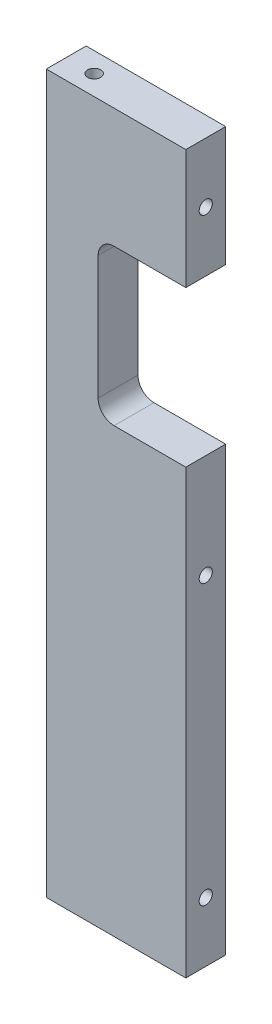
ISO-10303-21;
HEADER;
FILE_DESCRIPTION(('STEP AP214'),'2;1');
FILE_NAME('part.step','',(''),(''),'','','');
FILE_SCHEMA(('AUTOMOTIVE_DESIGN { 1 0 10303 214 1 1 1 1 }'));
ENDSEC;
DATA;
#1=APPLICATION_CONTEXT('core data for automotive mechanical design processes');
#2=APPLICATION_PROTOCOL_DEFINITION('international standard','automotive_design',2000,#1);
#3=PRODUCT_CONTEXT('',#1,'mechanical');
#4=PRODUCT('Part','Part','',(#3));
#5=PRODUCT_RELATED_PRODUCT_CATEGORY('part','',(#4));
#6=PRODUCT_DEFINITION_FORMATION('','',#4);
#7=PRODUCT_DEFINITION_CONTEXT('part definition',#1,'design');
#8=PRODUCT_DEFINITION('design','',#6,#7);
#9=PRODUCT_DEFINITION_SHAPE('','',#8);
#10=(LENGTH_UNIT() NAMED_UNIT(*) SI_UNIT(.MILLI.,.METRE.));
#11=(NAMED_UNIT(*) PLANE_ANGLE_UNIT() SI_UNIT($,.RADIAN.));
#12=(NAMED_UNIT(*) SI_UNIT($,.STERADIAN.) SOLID_ANGLE_UNIT());
#13=UNCERTAINTY_MEASURE_WITH_UNIT(LENGTH_MEASURE(1.E-05),#10,'distance_accuracy_value','');
#14=(GEOMETRIC_REPRESENTATION_CONTEXT(3) GLOBAL_UNCERTAINTY_ASSIGNED_CONTEXT((#13)) GLOBAL_UNIT_ASSIGNED_CONTEXT((#10,
#11,#12)) REPRESENTATION_CONTEXT('',''));
#15=CARTESIAN_POINT('',(0.,0.,0.));
#16=DIRECTION('',(0.,0.,1.));
#17=DIRECTION('',(1.,0.,0.));
#18=AXIS2_PLACEMENT_3D('',#15,#16,#17);
#19=CARTESIAN_POINT('',(6.7953462850714,68.755041031653,10.));
#20=DIRECTION('',(-1.,0.,0.));
#21=DIRECTION('',(0.,-1.,0.));
#22=AXIS2_PLACEMENT_3D('',#19,#20,#21);
#23=PLANE('',#22);
#24=CARTESIAN_POINT('',(6.7953462850714,53.7550410316531,5.00000000000039));
#25=DIRECTION('',(1.,0.,0.));
#26=DIRECTION('',(0.,1.,0.));
#27=AXIS2_PLACEMENT_3D('',#24,#25,#26);
#28=CIRCLE('',#27,1.65000000000039);
#29=CARTESIAN_POINT('',(6.7953462850714,55.4050410316535,5.00000000000039));
#30=VERTEX_POINT('',#29);
#31=EDGE_CURVE('E283',#30,#30,#28,.T.);
#32=ORIENTED_EDGE('',*,*,#31,.F.);
#33=EDGE_LOOP('',(#32));
#34=FACE_BOUND('',#33,.T.);
#35=DIRECTION('',(0.,1.,0.));
#36=VECTOR('',#35,1.);
#37=CARTESIAN_POINT('',(6.7953462850714,68.755041031653,10.));
#38=LINE('',#37,#36);
#39=CARTESIAN_POINT('',(6.79534628507142,38.755041031653,10.));
#40=VERTEX_POINT('',#39);
#41=CARTESIAN_POINT('',(6.7953462850714,68.755041031653,10.));
#42=VERTEX_POINT('',#41);
#43=EDGE_CURVE('E196',#40,#42,#38,.T.);
#44=ORIENTED_EDGE('',*,*,#43,.F.);
#45=DIRECTION('',(0.,0.,-1.));
#46=VECTOR('',#45,1.);
#47=CARTESIAN_POINT('',(6.79534628507142,38.755041031653,39.));
#48=LINE('',#47,#46);
#49=CARTESIAN_POINT('',(6.79534628507142,38.755041031653,0.));
#50=VERTEX_POINT('',#49);
#51=EDGE_CURVE('E183',#40,#50,#48,.T.);
#52=ORIENTED_EDGE('',*,*,#51,.T.);
#53=DIRECTION('',(0.,1.,0.));
#54=VECTOR('',#53,1.);
#55=CARTESIAN_POINT('',(6.7953462850714,68.755041031653,0.));
#56=LINE('',#55,#54);
#57=CARTESIAN_POINT('',(6.7953462850714,68.755041031653,0.));
#58=VERTEX_POINT('',#57);
#59=EDGE_CURVE('E206',#50,#58,#56,.T.);
#60=ORIENTED_EDGE('',*,*,#59,.T.);
#61=DIRECTION('',(0.,0.,-1.));
#62=VECTOR('',#61,1.);
#63=CARTESIAN_POINT('',(6.7953462850714,68.755041031653,10.));
#64=LINE('',#63,#62);
#65=EDGE_CURVE('E212',#42,#58,#64,.T.);
#66=ORIENTED_EDGE('',*,*,#65,.F.);
#67=EDGE_LOOP('',(#44,#52,#60,#66));
#68=FACE_BOUND('',#67,.T.);
#69=ADVANCED_FACE('F33',(#34,#68),#23,.F.);
#70=CARTESIAN_POINT('',(-28.2046537149286,68.755041031653,10.));
#71=DIRECTION('',(1.,0.,0.));
#72=DIRECTION('',(0.,1.,0.));
#73=AXIS2_PLACEMENT_3D('',#70,#71,#72);
#74=PLANE('',#73);
#75=CARTESIAN_POINT('',(-28.2046537149286,-81.3481814049515,4.99999999999995));
#76=DIRECTION('',(-1.,0.,0.));
#77=DIRECTION('',(0.,-1.,0.));
#78=AXIS2_PLACEMENT_3D('',#75,#76,#77);
#79=CIRCLE('',#78,1.65);
#80=CARTESIAN_POINT('',(-28.2046537149286,-82.9981814049516,4.99999999999995));
#81=VERTEX_POINT('',#80);
#82=EDGE_CURVE('E292',#81,#81,#79,.T.);
#83=ORIENTED_EDGE('',*,*,#82,.F.);
#84=EDGE_LOOP('',(#83));
#85=FACE_BOUND('',#84,.T.);
#86=CARTESIAN_POINT('',(-28.2046537149286,-21.3481814049516,4.99999999999994));
#87=DIRECTION('',(-1.,0.,0.));
#88=DIRECTION('',(0.,-1.,0.));
#89=AXIS2_PLACEMENT_3D('',#86,#87,#88);
#90=CIRCLE('',#89,1.65);
#91=CARTESIAN_POINT('',(-28.2046537149286,-22.9981814049516,4.99999999999994));
#92=VERTEX_POINT('',#91);
#93=EDGE_CURVE('E298',#92,#92,#90,.T.);
#94=ORIENTED_EDGE('',*,*,#93,.F.);
#95=EDGE_LOOP('',(#94));
#96=FACE_BOUND('',#95,.T.);
#97=CARTESIAN_POINT('',(-28.2046537149286,38.6518185950484,4.99999999999993));
#98=DIRECTION('',(-1.,0.,0.));
#99=DIRECTION('',(0.,-1.,0.));
#100=AXIS2_PLACEMENT_3D('',#97,#98,#99);
#101=CIRCLE('',#100,1.65);
#102=CARTESIAN_POINT('',(-28.2046537149286,37.0018185950484,4.99999999999993));
#103=VERTEX_POINT('',#102);
#104=EDGE_CURVE('E125',#103,#103,#101,.T.);
#105=ORIENTED_EDGE('',*,*,#104,.F.);
#106=EDGE_LOOP('',(#105));
#107=FACE_BOUND('',#106,.T.);
#108=DIRECTION('',(0.,-1.,0.));
#109=VECTOR('',#108,1.);
#110=CARTESIAN_POINT('',(-28.2046537149286,68.755041031653,0.));
#111=LINE('',#110,#109);
#112=CARTESIAN_POINT('',(-28.2046537149286,68.755041031653,0.));
#113=VERTEX_POINT('',#112);
#114=CARTESIAN_POINT('',(-28.2046537149286,-111.244958968347,0.));
#115=VERTEX_POINT('',#114);
#116=EDGE_CURVE('E189',#113,#115,#111,.T.);
#117=ORIENTED_EDGE('',*,*,#116,.T.);
#118=DIRECTION('',(0.,0.,-1.));
#119=VECTOR('',#118,1.);
#120=CARTESIAN_POINT('',(-28.2046537149286,-111.244958968347,10.));
#121=LINE('',#120,#119);
#122=CARTESIAN_POINT('',(-28.2046537149286,-111.244958968347,10.));
#123=VERTEX_POINT('',#122);
#124=EDGE_CURVE('E168',#123,#115,#121,.T.);
#125=ORIENTED_EDGE('',*,*,#124,.F.);
#126=DIRECTION('',(0.,-1.,0.));
#127=VECTOR('',#126,1.);
#128=CARTESIAN_POINT('',(-28.2046537149286,68.755041031653,10.));
#129=LINE('',#128,#127);
#130=CARTESIAN_POINT('',(-28.2046537149286,68.755041031653,10.));
#131=VERTEX_POINT('',#130);
#132=EDGE_CURVE('E190',#131,#123,#129,.T.);
#133=ORIENTED_EDGE('',*,*,#132,.F.);
#134=DIRECTION('',(0.,0.,-1.));
#135=VECTOR('',#134,1.);
#136=CARTESIAN_POINT('',(-28.2046537149286,68.755041031653,10.));
#137=LINE('',#136,#135);
#138=EDGE_CURVE('E201',#131,#113,#137,.T.);
#139=ORIENTED_EDGE('',*,*,#138,.T.);
#140=EDGE_LOOP('',(#117,#125,#133,#139));
#141=FACE_BOUND('',#140,.T.);
#142=ADVANCED_FACE('F225',(#85,#96,#107,#141),#74,.F.);
#143=CARTESIAN_POINT('',(-28.2046537149286,-111.244958968347,10.));
#144=DIRECTION('',(0.,1.,0.));
#145=DIRECTION('',(0.,0.,1.));
#146=AXIS2_PLACEMENT_3D('',#143,#144,#145);
#147=PLANE('',#146);
#148=CARTESIAN_POINT('',(-3.20465371492858,-111.244958968347,5.));
#149=DIRECTION('',(0.,-1.,0.));
#150=DIRECTION('',(0.,0.,-1.));
#151=AXIS2_PLACEMENT_3D('',#148,#149,#150);
#152=CIRCLE('',#151,1.20791329456803);
#153=CARTESIAN_POINT('',(-3.20465371492858,-111.244958968347,3.79208670543197));
#154=VERTEX_POINT('',#153);
#155=EDGE_CURVE('E388',#154,#154,#152,.T.);
#156=ORIENTED_EDGE('',*,*,#155,.F.);
#157=EDGE_LOOP('',(#156));
#158=FACE_BOUND('',#157,.T.);
#159=CARTESIAN_POINT('',(-22.2046537149286,-111.244958968347,5.));
#160=DIRECTION('',(0.,-1.,0.));
#161=DIRECTION('',(0.,0.,-1.));
#162=AXIS2_PLACEMENT_3D('',#159,#160,#161);
#163=CIRCLE('',#162,1.13947294137543);
#164=CARTESIAN_POINT('',(-22.2046537149286,-111.244958968347,3.86052705862457));
#165=VERTEX_POINT('',#164);
#166=EDGE_CURVE('E398',#165,#165,#163,.T.);
#167=ORIENTED_EDGE('',*,*,#166,.F.);
#168=EDGE_LOOP('',(#167));
#169=FACE_BOUND('',#168,.T.);
#170=DIRECTION('',(1.,0.,0.));
#171=VECTOR('',#170,1.);
#172=CARTESIAN_POINT('',(-28.2046537149286,-111.244958968347,0.));
#173=LINE('',#172,#171);
#174=CARTESIAN_POINT('',(6.79534628507142,-111.244958968347,0.));
#175=VERTEX_POINT('',#174);
#176=EDGE_CURVE('E204',#115,#175,#173,.T.);
#177=ORIENTED_EDGE('',*,*,#176,.T.);
#178=DIRECTION('',(0.,0.,-1.));
#179=VECTOR('',#178,1.);
#180=CARTESIAN_POINT('',(6.79534628507142,-111.244958968347,10.));
#181=LINE('',#180,#179);
#182=CARTESIAN_POINT('',(6.79534628507142,-111.244958968347,10.));
#183=VERTEX_POINT('',#182);
#184=EDGE_CURVE('E215',#183,#175,#181,.T.);
#185=ORIENTED_EDGE('',*,*,#184,.F.);
#186=DIRECTION('',(1.,0.,0.));
#187=VECTOR('',#186,1.);
#188=CARTESIAN_POINT('',(-28.2046537149286,-111.244958968347,10.));
#189=LINE('',#188,#187);
#190=EDGE_CURVE('E193',#123,#183,#189,.T.);
#191=ORIENTED_EDGE('',*,*,#190,.F.);
#192=ORIENTED_EDGE('',*,*,#124,.T.);
#193=EDGE_LOOP('',(#177,#185,#191,#192));
#194=FACE_BOUND('',#193,.T.);
#195=ADVANCED_FACE('F220',(#158,#169,#194),#147,.F.);
#196=CARTESIAN_POINT('',(6.79534628507142,-96.244958968347,4.99999999999977));
#197=DIRECTION('',(1.,0.,0.));
#198=DIRECTION('',(0.,1.,0.));
#199=AXIS2_PLACEMENT_3D('',#196,#197,#198);
#200=CIRCLE('',#199,1.64999999999984);
#201=CARTESIAN_POINT('',(6.79534628507142,-94.5949589683471,4.99999999999977));
#202=VERTEX_POINT('',#201);
#203=EDGE_CURVE('E274',#202,#202,#200,.T.);
#204=ORIENTED_EDGE('',*,*,#203,.F.);
#205=EDGE_LOOP('',(#204));
#206=FACE_BOUND('',#205,.T.);
#207=CARTESIAN_POINT('',(6.79534628507141,-26.2449589683469,5.00000000000008));
#208=DIRECTION('',(1.,0.,0.));
#209=DIRECTION('',(0.,1.,0.));
#210=AXIS2_PLACEMENT_3D('',#207,#208,#209);
#211=CIRCLE('',#210,1.65000000000012);
#212=CARTESIAN_POINT('',(6.79534628507141,-24.5949589683468,5.00000000000008));
#213=VERTEX_POINT('',#212);
#214=EDGE_CURVE('E277',#213,#213,#211,.T.);
#215=ORIENTED_EDGE('',*,*,#214,.F.);
#216=EDGE_LOOP('',(#215));
#217=FACE_BOUND('',#216,.T.);
#218=CARTESIAN_POINT('',(6.79534628507141,-0.244958968347003,0.));
#219=VERTEX_POINT('',#218);
#220=EDGE_CURVE('E207',#175,#219,#56,.T.);
#221=ORIENTED_EDGE('',*,*,#220,.T.);
#222=DIRECTION('',(0.,0.,-1.));
#223=VECTOR('',#222,1.);
#224=CARTESIAN_POINT('',(6.79534628507142,-0.244958968347024,39.));
#225=LINE('',#224,#223);
#226=CARTESIAN_POINT('',(6.79534628507142,-0.244958968347024,10.));
#227=VERTEX_POINT('',#226);
#228=EDGE_CURVE('E173',#227,#219,#225,.T.);
#229=ORIENTED_EDGE('',*,*,#228,.F.);
#230=EDGE_CURVE('E197',#183,#227,#38,.T.);
#231=ORIENTED_EDGE('',*,*,#230,.F.);
#232=ORIENTED_EDGE('',*,*,#184,.T.);
#233=EDGE_LOOP('',(#221,#229,#231,#232));
#234=FACE_BOUND('',#233,.T.);
#235=ADVANCED_FACE('F231',(#206,#217,#234),#23,.F.);
#236=CARTESIAN_POINT('',(-28.2046537149286,68.755041031653,10.));
#237=DIRECTION('',(0.,-1.,0.));
#238=DIRECTION('',(0.,0.,-1.));
#239=AXIS2_PLACEMENT_3D('',#236,#237,#238);
#240=PLANE('',#239);
#241=CARTESIAN_POINT('',(-21.2046537149285,68.755041031653,4.99999999999998));
#242=DIRECTION('',(0.,1.,0.));
#243=DIRECTION('',(0.,0.,1.));
#244=AXIS2_PLACEMENT_3D('',#241,#242,#243);
#245=CIRCLE('',#244,1.6499999999984);
#246=CARTESIAN_POINT('',(-21.2046537149285,68.755041031653,6.64999999999837));
#247=VERTEX_POINT('',#246);
#248=EDGE_CURVE('E389',#247,#247,#245,.T.);
#249=ORIENTED_EDGE('',*,*,#248,.F.);
#250=EDGE_LOOP('',(#249));
#251=FACE_BOUND('',#250,.T.);
#252=DIRECTION('',(-1.,0.,0.));
#253=VECTOR('',#252,1.);
#254=CARTESIAN_POINT('',(-28.2046537149286,68.755041031653,0.));
#255=LINE('',#254,#253);
#256=EDGE_CURVE('E194',#58,#113,#255,.T.);
#257=ORIENTED_EDGE('',*,*,#256,.T.);
#258=ORIENTED_EDGE('',*,*,#138,.F.);
#259=DIRECTION('',(-1.,0.,0.));
#260=VECTOR('',#259,1.);
#261=CARTESIAN_POINT('',(-28.2046537149286,68.755041031653,10.));
#262=LINE('',#261,#260);
#263=EDGE_CURVE('E199',#42,#131,#262,.T.);
#264=ORIENTED_EDGE('',*,*,#263,.F.);
#265=ORIENTED_EDGE('',*,*,#65,.T.);
#266=EDGE_LOOP('',(#257,#258,#264,#265));
#267=FACE_BOUND('',#266,.T.);
#268=ADVANCED_FACE('F237',(#251,#267),#240,.F.);
#269=CARTESIAN_POINT('',(0.,0.,10.));
#270=DIRECTION('',(0.,0.,1.));
#271=DIRECTION('',(1.,0.,0.));
#272=AXIS2_PLACEMENT_3D('',#269,#270,#271);
#273=PLANE('',#272);
#274=DIRECTION('',(-1.,0.,0.));
#275=VECTOR('',#274,1.);
#276=CARTESIAN_POINT('',(0.,38.755041031653,10.));
#277=LINE('',#276,#275);
#278=CARTESIAN_POINT('',(-11.2046537149286,38.755041031653,10.));
#279=VERTEX_POINT('',#278);
#280=EDGE_CURVE('E164',#40,#279,#277,.T.);
#281=ORIENTED_EDGE('',*,*,#280,.F.);
#282=ORIENTED_EDGE('',*,*,#43,.T.);
#283=ORIENTED_EDGE('',*,*,#263,.T.);
#284=ORIENTED_EDGE('',*,*,#132,.T.);
#285=ORIENTED_EDGE('',*,*,#190,.T.);
#286=ORIENTED_EDGE('',*,*,#230,.T.);
#287=DIRECTION('',(1.,0.,0.));
#288=VECTOR('',#287,1.);
#289=CARTESIAN_POINT('',(0.,-0.244958968347024,10.));
#290=LINE('',#289,#288);
#291=CARTESIAN_POINT('',(-11.2046537149286,-0.244958968347024,10.));
#292=VERTEX_POINT('',#291);
#293=EDGE_CURVE('E155',#292,#227,#290,.T.);
#294=ORIENTED_EDGE('',*,*,#293,.F.);
#295=CARTESIAN_POINT('',(-11.2046537149286,3.75504103165297,10.));
#296=DIRECTION('',(0.,0.,1.));
#297=DIRECTION('',(1.,0.,0.));
#298=AXIS2_PLACEMENT_3D('',#295,#296,#297);
#299=CIRCLE('',#298,4.);
#300=CARTESIAN_POINT('',(-15.2046537149286,3.75504103165297,10.));
#301=VERTEX_POINT('',#300);
#302=EDGE_CURVE('E121',#292,#301,#299,.F.);
#303=ORIENTED_EDGE('',*,*,#302,.T.);
#304=DIRECTION('',(0.,-1.,0.));
#305=VECTOR('',#304,1.);
#306=CARTESIAN_POINT('',(-15.2046537149286,0.,10.));
#307=LINE('',#306,#305);
#308=CARTESIAN_POINT('',(-15.2046537149286,34.755041031653,10.));
#309=VERTEX_POINT('',#308);
#310=EDGE_CURVE('E153',#309,#301,#307,.T.);
#311=ORIENTED_EDGE('',*,*,#310,.F.);
#312=CARTESIAN_POINT('',(-11.2046537149286,34.755041031653,10.));
#313=DIRECTION('',(0.,0.,1.));
#314=DIRECTION('',(1.,0.,0.));
#315=AXIS2_PLACEMENT_3D('',#312,#313,#314);
#316=CIRCLE('',#315,4.);
#317=EDGE_CURVE('E134',#309,#279,#316,.F.);
#318=ORIENTED_EDGE('',*,*,#317,.T.);
#319=EDGE_LOOP('',(#281,#282,#283,#284,#285,#286,#294,#303,#311,#318));
#320=FACE_BOUND('',#319,.T.);
#321=ADVANCED_FACE('F152',(#320),#273,.T.);
#322=CARTESIAN_POINT('',(0.,0.,0.));
#323=DIRECTION('',(0.,0.,1.));
#324=DIRECTION('',(1.,0.,0.));
#325=AXIS2_PLACEMENT_3D('',#322,#323,#324);
#326=PLANE('',#325);
#327=ORIENTED_EDGE('',*,*,#59,.F.);
#328=DIRECTION('',(1.,0.,0.));
#329=VECTOR('',#328,1.);
#330=CARTESIAN_POINT('',(6.79534628507142,38.755041031653,0.));
#331=LINE('',#330,#329);
#332=CARTESIAN_POINT('',(-11.2046537149286,38.755041031653,0.));
#333=VERTEX_POINT('',#332);
#334=EDGE_CURVE('E178',#333,#50,#331,.T.);
#335=ORIENTED_EDGE('',*,*,#334,.F.);
#336=CARTESIAN_POINT('',(-11.2046537149286,34.755041031653,0.));
#337=DIRECTION('',(0.,0.,1.));
#338=DIRECTION('',(1.,0.,0.));
#339=AXIS2_PLACEMENT_3D('',#336,#337,#338);
#340=CIRCLE('',#339,4.);
#341=CARTESIAN_POINT('',(-15.2046537149286,34.755041031653,0.));
#342=VERTEX_POINT('',#341);
#343=EDGE_CURVE('E142',#333,#342,#340,.T.);
#344=ORIENTED_EDGE('',*,*,#343,.T.);
#345=DIRECTION('',(0.,1.,0.));
#346=VECTOR('',#345,1.);
#347=CARTESIAN_POINT('',(-15.2046537149286,38.755041031653,0.));
#348=LINE('',#347,#346);
#349=CARTESIAN_POINT('',(-15.2046537149286,3.75504103165297,0.));
#350=VERTEX_POINT('',#349);
#351=EDGE_CURVE('E176',#350,#342,#348,.T.);
#352=ORIENTED_EDGE('',*,*,#351,.F.);
#353=CARTESIAN_POINT('',(-11.2046537149286,3.75504103165297,0.));
#354=DIRECTION('',(0.,0.,1.));
#355=DIRECTION('',(1.,0.,0.));
#356=AXIS2_PLACEMENT_3D('',#353,#354,#355);
#357=CIRCLE('',#356,4.);
#358=CARTESIAN_POINT('',(-11.2046537149286,-0.244958968347024,0.));
#359=VERTEX_POINT('',#358);
#360=EDGE_CURVE('E59',#350,#359,#357,.T.);
#361=ORIENTED_EDGE('',*,*,#360,.T.);
#362=DIRECTION('',(-1.,0.,0.));
#363=VECTOR('',#362,1.);
#364=CARTESIAN_POINT('',(6.79534628507142,-0.244958968347024,0.));
#365=LINE('',#364,#363);
#366=EDGE_CURVE('E124',#219,#359,#365,.T.);
#367=ORIENTED_EDGE('',*,*,#366,.F.);
#368=ORIENTED_EDGE('',*,*,#220,.F.);
#369=ORIENTED_EDGE('',*,*,#176,.F.);
#370=ORIENTED_EDGE('',*,*,#116,.F.);
#371=ORIENTED_EDGE('',*,*,#256,.F.);
#372=EDGE_LOOP('',(#327,#335,#344,#352,#361,#367,#368,#369,#370,#371));
#373=FACE_BOUND('',#372,.T.);
#374=ADVANCED_FACE('F229',(#373),#326,.F.);
#375=CARTESIAN_POINT('',(6.79534628507142,38.755041031653,39.));
#376=DIRECTION('',(0.,1.,0.));
#377=DIRECTION('',(0.,0.,1.));
#378=AXIS2_PLACEMENT_3D('',#375,#376,#377);
#379=PLANE('',#378);
#380=ORIENTED_EDGE('',*,*,#280,.T.);
#381=DIRECTION('',(0.,0.,-1.));
#382=VECTOR('',#381,1.);
#383=CARTESIAN_POINT('',(-11.2046537149286,38.755041031653,0.));
#384=LINE('',#383,#382);
#385=EDGE_CURVE('E137',#279,#333,#384,.T.);
#386=ORIENTED_EDGE('',*,*,#385,.T.);
#387=ORIENTED_EDGE('',*,*,#334,.T.);
#388=ORIENTED_EDGE('',*,*,#51,.F.);
#389=EDGE_LOOP('',(#380,#386,#387,#388));
#390=FACE_BOUND('',#389,.T.);
#391=ADVANCED_FACE('F241',(#390),#379,.F.);
#392=CARTESIAN_POINT('',(-15.2046537149286,38.755041031653,39.));
#393=DIRECTION('',(-1.,0.,0.));
#394=DIRECTION('',(0.,-1.,0.));
#395=AXIS2_PLACEMENT_3D('',#392,#393,#394);
#396=PLANE('',#395);
#397=ORIENTED_EDGE('',*,*,#351,.T.);
#398=DIRECTION('',(0.,0.,-1.));
#399=VECTOR('',#398,1.);
#400=CARTESIAN_POINT('',(-15.2046537149286,34.755041031653,10.));
#401=LINE('',#400,#399);
#402=EDGE_CURVE('E135',#342,#309,#401,.F.);
#403=ORIENTED_EDGE('',*,*,#402,.T.);
#404=ORIENTED_EDGE('',*,*,#310,.T.);
#405=DIRECTION('',(0.,0.,-1.));
#406=VECTOR('',#405,1.);
#407=CARTESIAN_POINT('',(-15.2046537149286,3.75504103165297,0.));
#408=LINE('',#407,#406);
#409=EDGE_CURVE('E163',#301,#350,#408,.T.);
#410=ORIENTED_EDGE('',*,*,#409,.T.);
#411=EDGE_LOOP('',(#397,#403,#404,#410));
#412=FACE_BOUND('',#411,.T.);
#413=ADVANCED_FACE('F162',(#412),#396,.F.);
#414=CARTESIAN_POINT('',(6.79534628507142,-0.244958968347024,39.));
#415=DIRECTION('',(0.,-1.,0.));
#416=DIRECTION('',(0.,0.,-1.));
#417=AXIS2_PLACEMENT_3D('',#414,#415,#416);
#418=PLANE('',#417);
#419=ORIENTED_EDGE('',*,*,#366,.T.);
#420=DIRECTION('',(0.,0.,-1.));
#421=VECTOR('',#420,1.);
#422=CARTESIAN_POINT('',(-11.2046537149286,-0.244958968347024,10.));
#423=LINE('',#422,#421);
#424=EDGE_CURVE('E145',#359,#292,#423,.F.);
#425=ORIENTED_EDGE('',*,*,#424,.T.);
#426=ORIENTED_EDGE('',*,*,#293,.T.);
#427=ORIENTED_EDGE('',*,*,#228,.T.);
#428=EDGE_LOOP('',(#419,#425,#426,#427));
#429=FACE_BOUND('',#428,.T.);
#430=ADVANCED_FACE('F130',(#429),#418,.F.);
#431=CARTESIAN_POINT('',(-11.2046537149286,34.755041031653,39.));
#432=DIRECTION('',(0.,0.,1.));
#433=DIRECTION('',(1.,0.,0.));
#434=AXIS2_PLACEMENT_3D('',#431,#432,#433);
#435=CYLINDRICAL_SURFACE('',#434,4.);
#436=DIRECTION('',(0.,0.,1.));
#437=VECTOR('',#436,1.);
#438=CARTESIAN_POINT('',(-13.2046537149286,38.2191426467907,39.));
#439=LINE('',#438,#437);
#440=CARTESIAN_POINT('',(-13.2046537149286,38.2191426467907,3.40774012052067));
#441=VERTEX_POINT('',#440);
#442=CARTESIAN_POINT('',(-13.2046537149286,38.2191426467907,6.59225987947918));
#443=VERTEX_POINT('',#442);
#444=EDGE_CURVE('E45',#441,#443,#439,.T.);
#445=ORIENTED_EDGE('',*,*,#444,.F.);
#446=CARTESIAN_POINT('',(-13.2046537149286,38.2191426467907,3.40774012052067));
#447=CARTESIAN_POINT('',(-13.2642924296829,38.1847276792713,3.41710538323452));
#448=CARTESIAN_POINT('',(-13.3228757293052,38.1488344405188,3.42804561424965));
#449=CARTESIAN_POINT('',(-13.4376700752825,38.0744230621559,3.45381715263762));
#450=CARTESIAN_POINT('',(-13.4938748336372,38.0358985926818,3.46865810668761));
#451=CARTESIAN_POINT('',(-13.6038471794177,37.9563720774322,3.50308861550594));
#452=CARTESIAN_POINT('',(-13.6575879176569,37.915350667395,3.52272017506465));
#453=CARTESIAN_POINT('',(-13.7615098597266,37.8318782333102,3.56736689783489));
#454=CARTESIAN_POINT('',(-13.8116949831458,37.7894288620303,3.59237600627532));
#455=CARTESIAN_POINT('',(-13.925604727016,37.6883187301122,3.65872044783551));
#456=CARTESIAN_POINT('',(-13.9876049217287,37.6293836157799,3.70268463530359));
#457=CARTESIAN_POINT('',(-14.1024137552706,37.5135946609107,3.80301120936347));
#458=CARTESIAN_POINT('',(-14.1552558611104,37.4567338686988,3.85932667323366));
#459=CARTESIAN_POINT('',(-14.2512178605752,37.3480622648806,3.98526297537314));
#460=CARTESIAN_POINT('',(-14.2942404687509,37.2963046486165,4.05500530950665));
#461=CARTESIAN_POINT('',(-14.369037412493,37.2025501705478,4.20626071376057));
#462=CARTESIAN_POINT('',(-14.4008085082809,37.1605561212737,4.28777716464205));
#463=CARTESIAN_POINT('',(-14.4494043912106,37.0944985889438,4.44878227672643));
#464=CARTESIAN_POINT('',(-14.4676213525072,37.0688284620704,4.52719607847443));
#465=CARTESIAN_POINT('',(-14.4952405245041,37.0293822073102,4.68843103006114));
#466=CARTESIAN_POINT('',(-14.5046476344806,37.0155994690248,4.77124970317725));
#467=CARTESIAN_POINT('',(-14.5143465138706,37.0013709408,4.93234090881226));
#468=CARTESIAN_POINT('',(-14.5152598326611,37.0000158448736,5.01049780752084));
#469=CARTESIAN_POINT('',(-14.5095990749262,37.0083412945583,5.16593741985314));
#470=CARTESIAN_POINT('',(-14.5030265765769,37.0180195141027,5.24322031426786));
#471=CARTESIAN_POINT('',(-14.4824894769143,37.047661340446,5.39367823142939));
#472=CARTESIAN_POINT('',(-14.4686237247097,37.0674873152433,5.46689404731204));
#473=CARTESIAN_POINT('',(-14.4335311731108,37.116236986968,5.6083471219315));
#474=CARTESIAN_POINT('',(-14.4123043870978,37.1451606673573,5.67658438971827));
#475=CARTESIAN_POINT('',(-14.3619927217173,37.2112506120984,5.80795669096328));
#476=CARTESIAN_POINT('',(-14.3327395025234,37.2485899825227,5.87093967078864));
#477=CARTESIAN_POINT('',(-14.2668960266488,37.3290198848195,5.98883855281108));
#478=CARTESIAN_POINT('',(-14.2303050734851,37.3721109625026,6.04375368836658));
#479=CARTESIAN_POINT('',(-14.1471825252445,37.4653387587183,6.14894956168483));
#480=CARTESIAN_POINT('',(-14.1000982754326,37.5157628637655,6.19853501199842));
#481=CARTESIAN_POINT('',(-13.9988540387906,37.6181916279643,6.28792371661644));
#482=CARTESIAN_POINT('',(-13.9446873246863,37.6701977532949,6.32771756547938));
#483=CARTESIAN_POINT('',(-13.8440164003838,37.7612377292662,6.38983332716543));
#484=CARTESIAN_POINT('',(-13.7987747642181,37.8004014058368,6.41405798053416));
#485=CARTESIAN_POINT('',(-13.7052011808638,37.877691091772,6.45780630143834));
#486=CARTESIAN_POINT('',(-13.6568676845566,37.9158165671095,6.47732758872175));
#487=CARTESIAN_POINT('',(-13.5575379990699,37.9904386310882,6.51220808905478));
#488=CARTESIAN_POINT('',(-13.5065418536423,38.026935246476,6.52756737046759));
#489=CARTESIAN_POINT('',(-13.4022267904025,38.0978916177419,6.55470552741307));
#490=CARTESIAN_POINT('',(-13.3489074022261,38.132350957793,6.5664836740212));
#491=CARTESIAN_POINT('',(-13.2649011496663,38.1838308445226,6.58235505172505));
#492=CARTESIAN_POINT('',(-13.2349133239285,38.2016744542636,6.58751140938134));
#493=CARTESIAN_POINT('',(-13.2046537149286,38.2191426467907,6.59225987947918));
#494=B_SPLINE_CURVE_WITH_KNOTS('',3,(#446,#447,#448,#449,#450,#451,#452,#453,#454,#455,#456,
#457,#458,#459,#460,#461,#462,#463,#464,#465,#466,#467,#468,#469,#470,#471,#472,#473,#474,#475,
#476,#477,#478,#479,#480,#481,#482,#483,#484,#485,#486,#487,#488,#489,#490,#491,#492,#493),
.UNSPECIFIED.,.F.,.F.,(4,2,2,2,2,2,2,2,2,2,2,2,2,2,2,2,2,2,2,2,2,2,2,4),(0.,0.208486995833814,
0.417494522391955,0.628405020995758,0.83907928005501,1.1264707914321,1.41278884724323,
1.70183107331425,1.99095645912517,2.24309143273943,2.49508610730796,2.72848121031579,
2.96182711757364,3.19208890616487,3.42235027617772,3.65786861839287,3.89340932612807,
4.14731686897784,4.40146736194077,4.59487790049401,4.78838611449274,4.9818911498221,
5.1754355459395,5.28122935784022),.UNSPECIFIED.);
#495=EDGE_CURVE('E11',#441,#443,#494,.T.);
#496=ORIENTED_EDGE('',*,*,#495,.T.);
#497=EDGE_LOOP('',(#445,#496));
#498=FACE_BOUND('',#497,.T.);
#499=ORIENTED_EDGE('',*,*,#317,.F.);
#500=ORIENTED_EDGE('',*,*,#402,.F.);
#501=ORIENTED_EDGE('',*,*,#343,.F.);
#502=ORIENTED_EDGE('',*,*,#385,.F.);
#503=EDGE_LOOP('',(#499,#500,#501,#502));
#504=FACE_BOUND('',#503,.T.);
#505=ADVANCED_FACE('F127',(#498,#504),#435,.F.);
#506=CARTESIAN_POINT('',(-11.2046537149286,3.75504103165297,39.));
#507=DIRECTION('',(0.,0.,1.));
#508=DIRECTION('',(1.,0.,0.));
#509=AXIS2_PLACEMENT_3D('',#506,#507,#508);
#510=CYLINDRICAL_SURFACE('',#509,4.);
#511=ORIENTED_EDGE('',*,*,#302,.F.);
#512=ORIENTED_EDGE('',*,*,#424,.F.);
#513=ORIENTED_EDGE('',*,*,#360,.F.);
#514=ORIENTED_EDGE('',*,*,#409,.F.);
#515=EDGE_LOOP('',(#511,#512,#513,#514));
#516=FACE_BOUND('',#515,.T.);
#517=ADVANCED_FACE('F35',(#516),#510,.F.);
#518=CARTESIAN_POINT('',(-13.2046537149286,38.6518185950484,4.99999999999993));
#519=DIRECTION('',(-1.,0.,0.));
#520=DIRECTION('',(0.,-1.,0.));
#521=AXIS2_PLACEMENT_3D('',#518,#519,#520);
#522=CYLINDRICAL_SURFACE('',#521,1.65);
#523=ORIENTED_EDGE('',*,*,#104,.T.);
#524=EDGE_LOOP('',(#523));
#525=FACE_BOUND('',#524,.T.);
#526=CARTESIAN_POINT('',(-13.2046537149286,38.6518185950484,4.99999999999993));
#527=DIRECTION('',(-1.,0.,0.));
#528=DIRECTION('',(0.,-1.,0.));
#529=AXIS2_PLACEMENT_3D('',#526,#527,#528);
#530=CIRCLE('',#529,1.65);
#531=EDGE_CURVE('E51',#443,#441,#530,.T.);
#532=ORIENTED_EDGE('',*,*,#531,.F.);
#533=ORIENTED_EDGE('',*,*,#495,.F.);
#534=EDGE_LOOP('',(#532,#533));
#535=FACE_BOUND('',#534,.T.);
#536=ADVANCED_FACE('F123',(#525,#535),#522,.F.);
#537=CARTESIAN_POINT('',(-13.2046537149286,38.6518185950484,4.99999999999993));
#538=DIRECTION('',(-1.,0.,0.));
#539=DIRECTION('',(0.,-1.,0.));
#540=AXIS2_PLACEMENT_3D('',#537,#538,#539);
#541=PLANE('',#540);
#542=ORIENTED_EDGE('',*,*,#444,.T.);
#543=ORIENTED_EDGE('',*,*,#531,.T.);
#544=EDGE_LOOP('',(#542,#543));
#545=FACE_BOUND('',#544,.T.);
#546=ADVANCED_FACE('F119',(#545),#541,.T.);
#547=CARTESIAN_POINT('',(-13.2046537149286,-21.3481814049516,4.99999999999994));
#548=DIRECTION('',(-1.,0.,0.));
#549=DIRECTION('',(0.,-1.,0.));
#550=AXIS2_PLACEMENT_3D('',#547,#548,#549);
#551=CYLINDRICAL_SURFACE('',#550,1.65);
#552=CARTESIAN_POINT('',(-13.2046537149286,-21.3481814049516,4.99999999999994));
#553=DIRECTION('',(-1.,0.,0.));
#554=DIRECTION('',(0.,-1.,0.));
#555=AXIS2_PLACEMENT_3D('',#552,#553,#554);
#556=CIRCLE('',#555,1.65);
#557=CARTESIAN_POINT('',(-13.2046537149286,-22.9981814049516,4.99999999999994));
#558=VERTEX_POINT('',#557);
#559=EDGE_CURVE('E301',#558,#558,#556,.T.);
#560=ORIENTED_EDGE('',*,*,#559,.F.);
#561=EDGE_LOOP('',(#560));
#562=FACE_BOUND('',#561,.T.);
#563=ORIENTED_EDGE('',*,*,#93,.T.);
#564=EDGE_LOOP('',(#563));
#565=FACE_BOUND('',#564,.T.);
#566=ADVANCED_FACE('F307',(#562,#565),#551,.F.);
#567=CARTESIAN_POINT('',(-13.2046537149286,-21.3481814049516,4.99999999999994));
#568=DIRECTION('',(-1.,0.,0.));
#569=DIRECTION('',(0.,-1.,0.));
#570=AXIS2_PLACEMENT_3D('',#567,#568,#569);
#571=PLANE('',#570);
#572=ORIENTED_EDGE('',*,*,#559,.T.);
#573=EDGE_LOOP('',(#572));
#574=FACE_BOUND('',#573,.T.);
#575=ADVANCED_FACE('F323',(#574),#571,.T.);
#576=CARTESIAN_POINT('',(-13.2046537149286,-81.3481814049515,4.99999999999995));
#577=DIRECTION('',(-1.,0.,0.));
#578=DIRECTION('',(0.,-1.,0.));
#579=AXIS2_PLACEMENT_3D('',#576,#577,#578);
#580=CYLINDRICAL_SURFACE('',#579,1.65);
#581=CARTESIAN_POINT('',(-13.2046537149286,-81.3481814049515,4.99999999999995));
#582=DIRECTION('',(-1.,0.,0.));
#583=DIRECTION('',(0.,-1.,0.));
#584=AXIS2_PLACEMENT_3D('',#581,#582,#583);
#585=CIRCLE('',#584,1.65);
#586=CARTESIAN_POINT('',(-13.2046537149286,-82.9981814049516,4.99999999999995));
#587=VERTEX_POINT('',#586);
#588=EDGE_CURVE('E295',#587,#587,#585,.T.);
#589=ORIENTED_EDGE('',*,*,#588,.F.);
#590=EDGE_LOOP('',(#589));
#591=FACE_BOUND('',#590,.T.);
#592=ORIENTED_EDGE('',*,*,#82,.T.);
#593=EDGE_LOOP('',(#592));
#594=FACE_BOUND('',#593,.T.);
#595=ADVANCED_FACE('F327',(#591,#594),#580,.F.);
#596=CARTESIAN_POINT('',(-13.2046537149286,-81.3481814049515,4.99999999999995));
#597=DIRECTION('',(-1.,0.,0.));
#598=DIRECTION('',(0.,-1.,0.));
#599=AXIS2_PLACEMENT_3D('',#596,#597,#598);
#600=PLANE('',#599);
#601=ORIENTED_EDGE('',*,*,#588,.T.);
#602=EDGE_LOOP('',(#601));
#603=FACE_BOUND('',#602,.T.);
#604=ADVANCED_FACE('F331',(#603),#600,.T.);
#605=CARTESIAN_POINT('',(-8.2046537149286,53.7550410316531,5.00000000000039));
#606=DIRECTION('',(1.,0.,0.));
#607=DIRECTION('',(0.,1.,0.));
#608=AXIS2_PLACEMENT_3D('',#605,#606,#607);
#609=CYLINDRICAL_SURFACE('',#608,1.65000000000039);
#610=CARTESIAN_POINT('',(-8.2046537149286,53.7550410316531,5.00000000000039));
#611=DIRECTION('',(1.,0.,0.));
#612=DIRECTION('',(0.,1.,0.));
#613=AXIS2_PLACEMENT_3D('',#610,#611,#612);
#614=CIRCLE('',#613,1.65000000000039);
#615=CARTESIAN_POINT('',(-8.2046537149286,55.4050410316535,5.00000000000039));
#616=VERTEX_POINT('',#615);
#617=EDGE_CURVE('E289',#616,#616,#614,.T.);
#618=ORIENTED_EDGE('',*,*,#617,.F.);
#619=EDGE_LOOP('',(#618));
#620=FACE_BOUND('',#619,.T.);
#621=ORIENTED_EDGE('',*,*,#31,.T.);
#622=EDGE_LOOP('',(#621));
#623=FACE_BOUND('',#622,.T.);
#624=ADVANCED_FACE('F335',(#620,#623),#609,.F.);
#625=CARTESIAN_POINT('',(-8.2046537149286,53.7550410316531,5.00000000000039));
#626=DIRECTION('',(1.,0.,0.));
#627=DIRECTION('',(0.,1.,0.));
#628=AXIS2_PLACEMENT_3D('',#625,#626,#627);
#629=PLANE('',#628);
#630=ORIENTED_EDGE('',*,*,#617,.T.);
#631=EDGE_LOOP('',(#630));
#632=FACE_BOUND('',#631,.T.);
#633=ADVANCED_FACE('F339',(#632),#629,.T.);
#634=CARTESIAN_POINT('',(-8.20465371492859,-26.2449589683469,5.00000000000008));
#635=DIRECTION('',(1.,0.,0.));
#636=DIRECTION('',(0.,1.,0.));
#637=AXIS2_PLACEMENT_3D('',#634,#635,#636);
#638=CYLINDRICAL_SURFACE('',#637,1.65000000000012);
#639=CARTESIAN_POINT('',(-8.20465371492859,-26.2449589683469,5.00000000000008));
#640=DIRECTION('',(1.,0.,0.));
#641=DIRECTION('',(0.,1.,0.));
#642=AXIS2_PLACEMENT_3D('',#639,#640,#641);
#643=CIRCLE('',#642,1.65000000000012);
#644=CARTESIAN_POINT('',(-8.20465371492859,-24.5949589683468,5.00000000000008));
#645=VERTEX_POINT('',#644);
#646=EDGE_CURVE('E279',#645,#645,#643,.T.);
#647=ORIENTED_EDGE('',*,*,#646,.F.);
#648=EDGE_LOOP('',(#647));
#649=FACE_BOUND('',#648,.T.);
#650=ORIENTED_EDGE('',*,*,#214,.T.);
#651=EDGE_LOOP('',(#650));
#652=FACE_BOUND('',#651,.T.);
#653=ADVANCED_FACE('F343',(#649,#652),#638,.F.);
#654=CARTESIAN_POINT('',(-8.20465371492859,-26.2449589683469,5.00000000000008));
#655=DIRECTION('',(1.,0.,0.));
#656=DIRECTION('',(0.,1.,0.));
#657=AXIS2_PLACEMENT_3D('',#654,#655,#656);
#658=PLANE('',#657);
#659=ORIENTED_EDGE('',*,*,#646,.T.);
#660=EDGE_LOOP('',(#659));
#661=FACE_BOUND('',#660,.T.);
#662=ADVANCED_FACE('F347',(#661),#658,.T.);
#663=CARTESIAN_POINT('',(-8.20465371492858,-96.244958968347,4.99999999999977));
#664=DIRECTION('',(1.,0.,0.));
#665=DIRECTION('',(0.,1.,0.));
#666=AXIS2_PLACEMENT_3D('',#663,#664,#665);
#667=CYLINDRICAL_SURFACE('',#666,1.64999999999984);
#668=CARTESIAN_POINT('',(-8.20465371492858,-96.244958968347,4.99999999999977));
#669=DIRECTION('',(1.,0.,0.));
#670=DIRECTION('',(0.,1.,0.));
#671=AXIS2_PLACEMENT_3D('',#668,#669,#670);
#672=CIRCLE('',#671,1.64999999999984);
#673=CARTESIAN_POINT('',(-8.20465371492858,-94.5949589683471,4.99999999999977));
#674=VERTEX_POINT('',#673);
#675=EDGE_CURVE('E280',#674,#674,#672,.T.);
#676=ORIENTED_EDGE('',*,*,#675,.F.);
#677=EDGE_LOOP('',(#676));
#678=FACE_BOUND('',#677,.T.);
#679=ORIENTED_EDGE('',*,*,#203,.T.);
#680=EDGE_LOOP('',(#679));
#681=FACE_BOUND('',#680,.T.);
#682=ADVANCED_FACE('F351',(#678,#681),#667,.F.);
#683=CARTESIAN_POINT('',(-8.20465371492858,-96.244958968347,4.99999999999977));
#684=DIRECTION('',(1.,0.,0.));
#685=DIRECTION('',(0.,1.,0.));
#686=AXIS2_PLACEMENT_3D('',#683,#684,#685);
#687=PLANE('',#686);
#688=ORIENTED_EDGE('',*,*,#675,.T.);
#689=EDGE_LOOP('',(#688));
#690=FACE_BOUND('',#689,.T.);
#691=ADVANCED_FACE('F355',(#690),#687,.T.);
#692=CARTESIAN_POINT('',(-22.2046537149286,-99.244958968347,5.));
#693=DIRECTION('',(0.,-1.,0.));
#694=DIRECTION('',(0.,0.,-1.));
#695=AXIS2_PLACEMENT_3D('',#692,#693,#694);
#696=CYLINDRICAL_SURFACE('',#695,1.13947294137543);
#697=CARTESIAN_POINT('',(-22.2046537149286,-99.244958968347,5.));
#698=DIRECTION('',(0.,-1.,0.));
#699=DIRECTION('',(0.,0.,-1.));
#700=AXIS2_PLACEMENT_3D('',#697,#698,#699);
#701=CIRCLE('',#700,1.13947294137543);
#702=CARTESIAN_POINT('',(-22.2046537149286,-99.244958968347,3.86052705862457));
#703=VERTEX_POINT('',#702);
#704=EDGE_CURVE('E400',#703,#703,#701,.T.);
#705=ORIENTED_EDGE('',*,*,#704,.F.);
#706=EDGE_LOOP('',(#705));
#707=FACE_BOUND('',#706,.T.);
#708=ORIENTED_EDGE('',*,*,#166,.T.);
#709=EDGE_LOOP('',(#708));
#710=FACE_BOUND('',#709,.T.);
#711=ADVANCED_FACE('F359',(#707,#710),#696,.F.);
#712=CARTESIAN_POINT('',(-22.2046537149286,-99.244958968347,5.));
#713=DIRECTION('',(0.,-1.,0.));
#714=DIRECTION('',(0.,0.,-1.));
#715=AXIS2_PLACEMENT_3D('',#712,#713,#714);
#716=PLANE('',#715);
#717=ORIENTED_EDGE('',*,*,#704,.T.);
#718=EDGE_LOOP('',(#717));
#719=FACE_BOUND('',#718,.T.);
#720=ADVANCED_FACE('F363',(#719),#716,.T.);
#721=CARTESIAN_POINT('',(-3.20465371492858,-99.244958968347,5.));
#722=DIRECTION('',(0.,-1.,0.));
#723=DIRECTION('',(0.,0.,-1.));
#724=AXIS2_PLACEMENT_3D('',#721,#722,#723);
#725=CYLINDRICAL_SURFACE('',#724,1.20791329456803);
#726=CARTESIAN_POINT('',(-3.20465371492858,-99.244958968347,5.));
#727=DIRECTION('',(0.,-1.,0.));
#728=DIRECTION('',(0.,0.,-1.));
#729=AXIS2_PLACEMENT_3D('',#726,#727,#728);
#730=CIRCLE('',#729,1.20791329456803);
#731=CARTESIAN_POINT('',(-3.20465371492858,-99.244958968347,3.79208670543197));
#732=VERTEX_POINT('',#731);
#733=EDGE_CURVE('E392',#732,#732,#730,.T.);
#734=ORIENTED_EDGE('',*,*,#733,.F.);
#735=EDGE_LOOP('',(#734));
#736=FACE_BOUND('',#735,.T.);
#737=ORIENTED_EDGE('',*,*,#155,.T.);
#738=EDGE_LOOP('',(#737));
#739=FACE_BOUND('',#738,.T.);
#740=ADVANCED_FACE('F367',(#736,#739),#725,.F.);
#741=CARTESIAN_POINT('',(-3.20465371492858,-99.244958968347,5.));
#742=DIRECTION('',(0.,-1.,0.));
#743=DIRECTION('',(0.,0.,-1.));
#744=AXIS2_PLACEMENT_3D('',#741,#742,#743);
#745=PLANE('',#744);
#746=ORIENTED_EDGE('',*,*,#733,.T.);
#747=EDGE_LOOP('',(#746));
#748=FACE_BOUND('',#747,.T.);
#749=ADVANCED_FACE('F371',(#748),#745,.T.);
#750=CARTESIAN_POINT('',(-21.2046537149285,56.755041031653,4.99999999999998));
#751=DIRECTION('',(0.,1.,0.));
#752=DIRECTION('',(0.,0.,1.));
#753=AXIS2_PLACEMENT_3D('',#750,#751,#752);
#754=CYLINDRICAL_SURFACE('',#753,1.6499999999984);
#755=CARTESIAN_POINT('',(-21.2046537149285,56.755041031653,4.99999999999998));
#756=DIRECTION('',(0.,1.,0.));
#757=DIRECTION('',(0.,0.,1.));
#758=AXIS2_PLACEMENT_3D('',#755,#756,#757);
#759=CIRCLE('',#758,1.6499999999984);
#760=CARTESIAN_POINT('',(-21.2046537149285,56.755041031653,6.64999999999837));
#761=VERTEX_POINT('',#760);
#762=EDGE_CURVE('E387',#761,#761,#759,.T.);
#763=ORIENTED_EDGE('',*,*,#762,.F.);
#764=EDGE_LOOP('',(#763));
#765=FACE_BOUND('',#764,.T.);
#766=ORIENTED_EDGE('',*,*,#248,.T.);
#767=EDGE_LOOP('',(#766));
#768=FACE_BOUND('',#767,.T.);
#769=ADVANCED_FACE('F375',(#765,#768),#754,.F.);
#770=CARTESIAN_POINT('',(-21.2046537149285,56.755041031653,4.99999999999998));
#771=DIRECTION('',(0.,1.,0.));
#772=DIRECTION('',(0.,0.,1.));
#773=AXIS2_PLACEMENT_3D('',#770,#771,#772);
#774=PLANE('',#773);
#775=ORIENTED_EDGE('',*,*,#762,.T.);
#776=EDGE_LOOP('',(#775));
#777=FACE_BOUND('',#776,.T.);
#778=ADVANCED_FACE('F379',(#777),#774,.T.);
#779=CLOSED_SHELL('',(#69,#142,#195,#235,#268,#321,#374,#391,#413,#430,#505,#517,#536,#546,#566,
#575,#595,#604,#624,#633,#653,#662,#682,#691,#711,#720,#740,#749,#769,#778));
#780=MANIFOLD_SOLID_BREP('B2',#779);
#781=ADVANCED_BREP_SHAPE_REPRESENTATION('',(#18,#780),#14);
#782=SHAPE_DEFINITION_REPRESENTATION(#9,#781);
ENDSEC;
END-ISO-10303-21;
